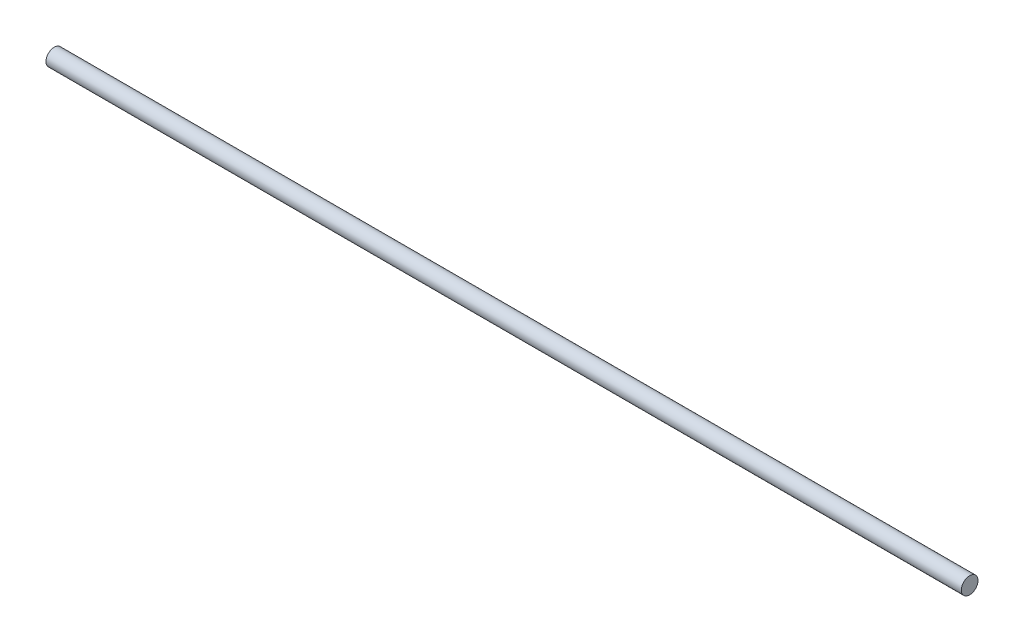
ISO-10303-21;
HEADER;
FILE_DESCRIPTION(('STEP AP214'),'2;1');
FILE_NAME('part.step','',(''),(''),'','','');
FILE_SCHEMA(('AUTOMOTIVE_DESIGN { 1 0 10303 214 1 1 1 1 }'));
ENDSEC;
DATA;
#1=APPLICATION_CONTEXT('core data for automotive mechanical design processes');
#2=APPLICATION_PROTOCOL_DEFINITION('international standard','automotive_design',2000,#1);
#3=PRODUCT_CONTEXT('',#1,'mechanical');
#4=PRODUCT('Part','Part','',(#3));
#5=PRODUCT_RELATED_PRODUCT_CATEGORY('part','',(#4));
#6=PRODUCT_DEFINITION_FORMATION('','',#4);
#7=PRODUCT_DEFINITION_CONTEXT('part definition',#1,'design');
#8=PRODUCT_DEFINITION('design','',#6,#7);
#9=PRODUCT_DEFINITION_SHAPE('','',#8);
#10=(LENGTH_UNIT() NAMED_UNIT(*) SI_UNIT(.MILLI.,.METRE.));
#11=(NAMED_UNIT(*) PLANE_ANGLE_UNIT() SI_UNIT($,.RADIAN.));
#12=(NAMED_UNIT(*) SI_UNIT($,.STERADIAN.) SOLID_ANGLE_UNIT());
#13=UNCERTAINTY_MEASURE_WITH_UNIT(LENGTH_MEASURE(1.E-05),#10,'distance_accuracy_value','');
#14=(GEOMETRIC_REPRESENTATION_CONTEXT(3) GLOBAL_UNCERTAINTY_ASSIGNED_CONTEXT((#13)) GLOBAL_UNIT_ASSIGNED_CONTEXT((#10,
#11,#12)) REPRESENTATION_CONTEXT('',''));
#15=CARTESIAN_POINT('',(0.,0.,0.));
#16=DIRECTION('',(0.,0.,1.));
#17=DIRECTION('',(1.,0.,0.));
#18=AXIS2_PLACEMENT_3D('',#15,#16,#17);
#19=CARTESIAN_POINT('',(110.,0.,0.));
#20=DIRECTION('',(-1.,0.,0.));
#21=DIRECTION('',(0.,0.,1.));
#22=AXIS2_PLACEMENT_3D('',#19,#20,#21);
#23=CYLINDRICAL_SURFACE('',#22,2.);
#24=CARTESIAN_POINT('',(110.,0.,0.));
#25=DIRECTION('',(1.,0.,0.));
#26=DIRECTION('',(0.,0.,-1.));
#27=AXIS2_PLACEMENT_3D('',#24,#25,#26);
#28=CIRCLE('',#27,2.);
#29=CARTESIAN_POINT('',(110.,0.,-2.));
#30=VERTEX_POINT('',#29);
#31=EDGE_CURVE('E10',#30,#30,#28,.T.);
#32=ORIENTED_EDGE('',*,*,#31,.F.);
#33=EDGE_LOOP('',(#32));
#34=FACE_BOUND('',#33,.T.);
#35=CARTESIAN_POINT('',(-110.,0.,0.));
#36=DIRECTION('',(1.,0.,0.));
#37=DIRECTION('',(0.,0.,-1.));
#38=AXIS2_PLACEMENT_3D('',#35,#36,#37);
#39=CIRCLE('',#38,2.);
#40=CARTESIAN_POINT('',(-110.,0.,-2.));
#41=VERTEX_POINT('',#40);
#42=EDGE_CURVE('E36',#41,#41,#39,.T.);
#43=ORIENTED_EDGE('',*,*,#42,.T.);
#44=EDGE_LOOP('',(#43));
#45=FACE_BOUND('',#44,.T.);
#46=ADVANCED_FACE('F33',(#34,#45),#23,.T.);
#47=CARTESIAN_POINT('',(110.,0.,0.));
#48=DIRECTION('',(1.,0.,0.));
#49=DIRECTION('',(0.,0.,-1.));
#50=AXIS2_PLACEMENT_3D('',#47,#48,#49);
#51=PLANE('',#50);
#52=ORIENTED_EDGE('',*,*,#31,.T.);
#53=EDGE_LOOP('',(#52));
#54=FACE_BOUND('',#53,.T.);
#55=ADVANCED_FACE('F48',(#54),#51,.T.);
#56=CARTESIAN_POINT('',(-110.,0.,0.));
#57=DIRECTION('',(1.,0.,0.));
#58=DIRECTION('',(0.,0.,-1.));
#59=AXIS2_PLACEMENT_3D('',#56,#57,#58);
#60=PLANE('',#59);
#61=ORIENTED_EDGE('',*,*,#42,.F.);
#62=EDGE_LOOP('',(#61));
#63=FACE_BOUND('',#62,.T.);
#64=ADVANCED_FACE('F46',(#63),#60,.F.);
#65=CLOSED_SHELL('',(#46,#55,#64));
#66=MANIFOLD_SOLID_BREP('B2',#65);
#67=ADVANCED_BREP_SHAPE_REPRESENTATION('',(#18,#66),#14);
#68=SHAPE_DEFINITION_REPRESENTATION(#9,#67);
ENDSEC;
END-ISO-10303-21;
